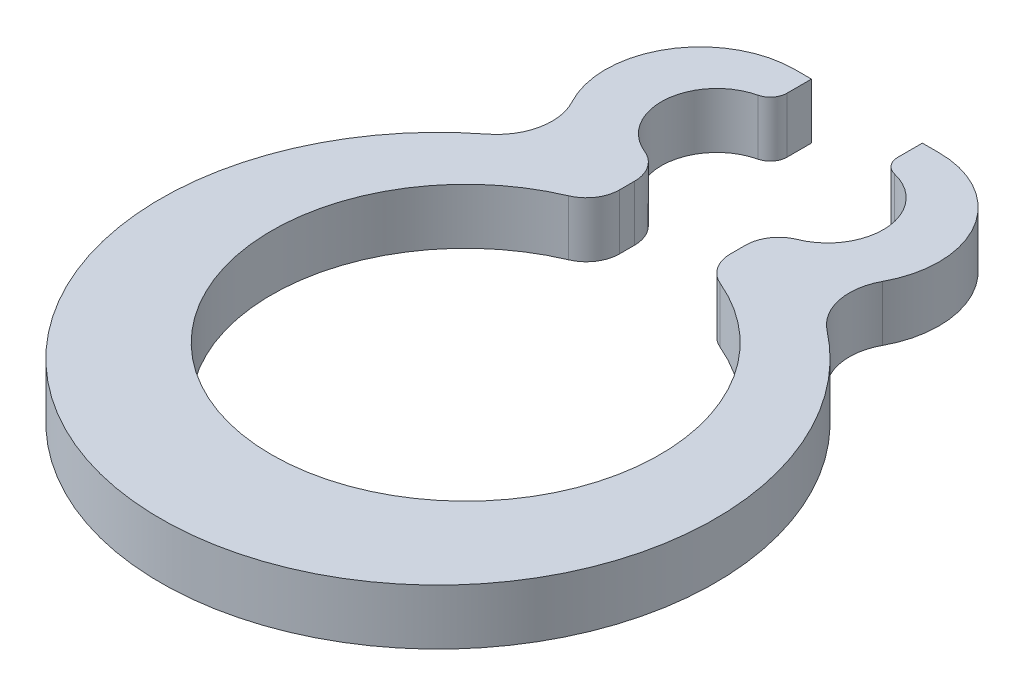
ISO-10303-21;
HEADER;
FILE_DESCRIPTION(('STEP AP214'),'2;1');
FILE_NAME('part.step','',(''),(''),'','','');
FILE_SCHEMA(('AUTOMOTIVE_DESIGN { 1 0 10303 214 1 1 1 1 }'));
ENDSEC;
DATA;
#1=APPLICATION_CONTEXT('core data for automotive mechanical design processes');
#2=APPLICATION_PROTOCOL_DEFINITION('international standard','automotive_design',2000,#1);
#3=PRODUCT_CONTEXT('',#1,'mechanical');
#4=PRODUCT('Part','Part','',(#3));
#5=PRODUCT_RELATED_PRODUCT_CATEGORY('part','',(#4));
#6=PRODUCT_DEFINITION_FORMATION('','',#4);
#7=PRODUCT_DEFINITION_CONTEXT('part definition',#1,'design');
#8=PRODUCT_DEFINITION('design','',#6,#7);
#9=PRODUCT_DEFINITION_SHAPE('','',#8);
#10=(LENGTH_UNIT() NAMED_UNIT(*) SI_UNIT(.MILLI.,.METRE.));
#11=(NAMED_UNIT(*) PLANE_ANGLE_UNIT() SI_UNIT($,.RADIAN.));
#12=(NAMED_UNIT(*) SI_UNIT($,.STERADIAN.) SOLID_ANGLE_UNIT());
#13=UNCERTAINTY_MEASURE_WITH_UNIT(LENGTH_MEASURE(1.E-05),#10,'distance_accuracy_value','');
#14=(GEOMETRIC_REPRESENTATION_CONTEXT(3) GLOBAL_UNCERTAINTY_ASSIGNED_CONTEXT((#13)) GLOBAL_UNIT_ASSIGNED_CONTEXT((#10,
#11,#12)) REPRESENTATION_CONTEXT('',''));
#15=CARTESIAN_POINT('',(0.,0.,0.));
#16=DIRECTION('',(0.,0.,1.));
#17=DIRECTION('',(1.,0.,0.));
#18=AXIS2_PLACEMENT_3D('',#15,#16,#17);
#19=CARTESIAN_POINT('',(-0.65,0.5,-3.6172697343063));
#20=DIRECTION('',(0.,0.,1.));
#21=DIRECTION('',(1.,0.,0.));
#22=AXIS2_PLACEMENT_3D('',#19,#20,#21);
#23=PLANE('',#22);
#24=DIRECTION('',(-1.,0.,0.));
#25=VECTOR('',#24,1.);
#26=CARTESIAN_POINT('',(-0.65,0.,-3.6172697343063));
#27=LINE('',#26,#25);
#28=CARTESIAN_POINT('',(-0.5,0.,-3.6172697343063));
#29=VERTEX_POINT('',#28);
#30=CARTESIAN_POINT('',(-0.65,0.,-3.6172697343063));
#31=VERTEX_POINT('',#30);
#32=EDGE_CURVE('E207',#29,#31,#27,.T.);
#33=ORIENTED_EDGE('',*,*,#32,.T.);
#34=DIRECTION('',(0.,-1.,0.));
#35=VECTOR('',#34,1.);
#36=CARTESIAN_POINT('',(-0.65,0.5,-3.6172697343063));
#37=LINE('',#36,#35);
#38=CARTESIAN_POINT('',(-0.65,0.5,-3.6172697343063));
#39=VERTEX_POINT('',#38);
#40=EDGE_CURVE('E11',#39,#31,#37,.T.);
#41=ORIENTED_EDGE('',*,*,#40,.F.);
#42=DIRECTION('',(-1.,0.,0.));
#43=VECTOR('',#42,1.);
#44=CARTESIAN_POINT('',(-0.65,0.5,-3.6172697343063));
#45=LINE('',#44,#43);
#46=CARTESIAN_POINT('',(-0.5,0.5,-3.6172697343063));
#47=VERTEX_POINT('',#46);
#48=EDGE_CURVE('E245',#47,#39,#45,.T.);
#49=ORIENTED_EDGE('',*,*,#48,.F.);
#50=DIRECTION('',(0.,-1.,0.));
#51=VECTOR('',#50,1.);
#52=CARTESIAN_POINT('',(-0.5,0.5,-3.6172697343063));
#53=LINE('',#52,#51);
#54=EDGE_CURVE('E203',#47,#29,#53,.T.);
#55=ORIENTED_EDGE('',*,*,#54,.T.);
#56=EDGE_LOOP('',(#33,#41,#49,#55));
#57=FACE_BOUND('',#56,.T.);
#58=ADVANCED_FACE('F39',(#57),#23,.F.);
#59=CARTESIAN_POINT('',(-0.65,0.5,-2.76407935800148));
#60=DIRECTION('',(0.,-1.,0.));
#61=DIRECTION('',(0.,0.,-1.));
#62=AXIS2_PLACEMENT_3D('',#59,#60,#61);
#63=CYLINDRICAL_SURFACE('',#62,0.853190376304816);
#64=CARTESIAN_POINT('',(-0.65,0.,-2.76407935800148));
#65=DIRECTION('',(0.,1.,0.));
#66=DIRECTION('',(0.,0.,1.));
#67=AXIS2_PLACEMENT_3D('',#64,#65,#66);
#68=CIRCLE('',#67,0.853190376304816);
#69=CARTESIAN_POINT('',(-1.40020629242879,0.,-2.35772441830048));
#70=VERTEX_POINT('',#69);
#71=EDGE_CURVE('E210',#31,#70,#68,.T.);
#72=ORIENTED_EDGE('',*,*,#71,.T.);
#73=DIRECTION('',(0.,-1.,0.));
#74=VECTOR('',#73,1.);
#75=CARTESIAN_POINT('',(-1.40020629242879,0.5,-2.35772441830048));
#76=LINE('',#75,#74);
#77=CARTESIAN_POINT('',(-1.40020629242879,0.5,-2.35772441830048));
#78=VERTEX_POINT('',#77);
#79=EDGE_CURVE('E47',#78,#70,#76,.T.);
#80=ORIENTED_EDGE('',*,*,#79,.F.);
#81=CARTESIAN_POINT('',(-0.65,0.5,-2.76407935800148));
#82=DIRECTION('',(0.,1.,0.));
#83=DIRECTION('',(0.,0.,1.));
#84=AXIS2_PLACEMENT_3D('',#81,#82,#83);
#85=CIRCLE('',#84,0.853190376304816);
#86=EDGE_CURVE('E134',#39,#78,#85,.T.);
#87=ORIENTED_EDGE('',*,*,#86,.F.);
#88=ORIENTED_EDGE('',*,*,#40,.T.);
#89=EDGE_LOOP('',(#72,#80,#87,#88));
#90=FACE_BOUND('',#89,.T.);
#91=ADVANCED_FACE('F363',(#90),#63,.T.);
#92=CARTESIAN_POINT('',(-1.83985394508865,0.5,-2.11958592600938));
#93=DIRECTION('',(0.,-1.,0.));
#94=DIRECTION('',(0.,0.,-1.));
#95=AXIS2_PLACEMENT_3D('',#92,#93,#94);
#96=CYLINDRICAL_SURFACE('',#95,0.5);
#97=CARTESIAN_POINT('',(-1.83985394508865,0.,-2.11958592600938));
#98=DIRECTION('',(0.,-1.,0.));
#99=DIRECTION('',(0.,0.,-1.));
#100=AXIS2_PLACEMENT_3D('',#97,#98,#99);
#101=CIRCLE('',#100,0.5);
#102=CARTESIAN_POINT('',(-1.5332116209072,0.,-1.72465493834115));
#103=VERTEX_POINT('',#102);
#104=EDGE_CURVE('E212',#70,#103,#101,.T.);
#105=ORIENTED_EDGE('',*,*,#104,.T.);
#106=DIRECTION('',(0.,-1.,0.));
#107=VECTOR('',#106,1.);
#108=CARTESIAN_POINT('',(-1.5332116209072,0.5,-1.72465493834115));
#109=LINE('',#108,#107);
#110=CARTESIAN_POINT('',(-1.5332116209072,0.5,-1.72465493834115));
#111=VERTEX_POINT('',#110);
#112=EDGE_CURVE('E288',#111,#103,#109,.T.);
#113=ORIENTED_EDGE('',*,*,#112,.F.);
#114=CARTESIAN_POINT('',(-1.83985394508865,0.5,-2.11958592600938));
#115=DIRECTION('',(0.,-1.,0.));
#116=DIRECTION('',(0.,0.,-1.));
#117=AXIS2_PLACEMENT_3D('',#114,#115,#116);
#118=CIRCLE('',#117,0.5);
#119=EDGE_CURVE('E296',#78,#111,#118,.T.);
#120=ORIENTED_EDGE('',*,*,#119,.F.);
#121=ORIENTED_EDGE('',*,*,#79,.T.);
#122=EDGE_LOOP('',(#105,#113,#120,#121));
#123=FACE_BOUND('',#122,.T.);
#124=ADVANCED_FACE('F294',(#123),#96,.F.);
#125=CARTESIAN_POINT('',(0.,0.5,0.25));
#126=DIRECTION('',(0.,-1.,0.));
#127=DIRECTION('',(0.,0.,-1.));
#128=AXIS2_PLACEMENT_3D('',#125,#126,#127);
#129=CYLINDRICAL_SURFACE('',#128,2.5);
#130=CARTESIAN_POINT('',(0.,0.,0.25));
#131=DIRECTION('',(0.,1.,0.));
#132=DIRECTION('',(0.,0.,1.));
#133=AXIS2_PLACEMENT_3D('',#130,#131,#132);
#134=CIRCLE('',#133,2.5);
#135=CARTESIAN_POINT('',(1.5332116209072,0.,-1.72465493834115));
#136=VERTEX_POINT('',#135);
#137=EDGE_CURVE('E214',#103,#136,#134,.T.);
#138=ORIENTED_EDGE('',*,*,#137,.T.);
#139=DIRECTION('',(0.,-1.,0.));
#140=VECTOR('',#139,1.);
#141=CARTESIAN_POINT('',(1.5332116209072,0.5,-1.72465493834115));
#142=LINE('',#141,#140);
#143=CARTESIAN_POINT('',(1.5332116209072,0.5,-1.72465493834115));
#144=VERTEX_POINT('',#143);
#145=EDGE_CURVE('E285',#144,#136,#142,.T.);
#146=ORIENTED_EDGE('',*,*,#145,.F.);
#147=CARTESIAN_POINT('',(0.,0.5,0.25));
#148=DIRECTION('',(0.,1.,0.));
#149=DIRECTION('',(0.,0.,1.));
#150=AXIS2_PLACEMENT_3D('',#147,#148,#149);
#151=CIRCLE('',#150,2.5);
#152=EDGE_CURVE('E314',#111,#144,#151,.T.);
#153=ORIENTED_EDGE('',*,*,#152,.F.);
#154=ORIENTED_EDGE('',*,*,#112,.T.);
#155=EDGE_LOOP('',(#138,#146,#153,#154));
#156=FACE_BOUND('',#155,.T.);
#157=ADVANCED_FACE('F305',(#156),#129,.T.);
#158=CARTESIAN_POINT('',(1.83985394508865,0.5,-2.11958592600938));
#159=DIRECTION('',(0.,-1.,0.));
#160=DIRECTION('',(0.,0.,-1.));
#161=AXIS2_PLACEMENT_3D('',#158,#159,#160);
#162=CYLINDRICAL_SURFACE('',#161,0.5);
#163=CARTESIAN_POINT('',(1.83985394508865,0.,-2.11958592600938));
#164=DIRECTION('',(0.,-1.,0.));
#165=DIRECTION('',(0.,0.,1.));
#166=AXIS2_PLACEMENT_3D('',#163,#164,#165);
#167=CIRCLE('',#166,0.5);
#168=CARTESIAN_POINT('',(1.40020629242879,0.,-2.35772441830048));
#169=VERTEX_POINT('',#168);
#170=EDGE_CURVE('E216',#136,#169,#167,.T.);
#171=ORIENTED_EDGE('',*,*,#170,.T.);
#172=DIRECTION('',(0.,-1.,0.));
#173=VECTOR('',#172,1.);
#174=CARTESIAN_POINT('',(1.40020629242879,0.5,-2.35772441830048));
#175=LINE('',#174,#173);
#176=CARTESIAN_POINT('',(1.40020629242879,0.5,-2.35772441830048));
#177=VERTEX_POINT('',#176);
#178=EDGE_CURVE('E282',#177,#169,#175,.T.);
#179=ORIENTED_EDGE('',*,*,#178,.F.);
#180=CARTESIAN_POINT('',(1.83985394508865,0.5,-2.11958592600938));
#181=DIRECTION('',(0.,-1.,0.));
#182=DIRECTION('',(0.,0.,1.));
#183=AXIS2_PLACEMENT_3D('',#180,#181,#182);
#184=CIRCLE('',#183,0.5);
#185=EDGE_CURVE('E311',#144,#177,#184,.T.);
#186=ORIENTED_EDGE('',*,*,#185,.F.);
#187=ORIENTED_EDGE('',*,*,#145,.T.);
#188=EDGE_LOOP('',(#171,#179,#186,#187));
#189=FACE_BOUND('',#188,.T.);
#190=ADVANCED_FACE('F309',(#189),#162,.F.);
#191=CARTESIAN_POINT('',(0.65,0.5,-2.76407935800148));
#192=DIRECTION('',(0.,-1.,0.));
#193=DIRECTION('',(0.,0.,-1.));
#194=AXIS2_PLACEMENT_3D('',#191,#192,#193);
#195=CYLINDRICAL_SURFACE('',#194,0.853190376304816);
#196=CARTESIAN_POINT('',(0.65,0.,-2.76407935800148));
#197=DIRECTION('',(0.,1.,0.));
#198=DIRECTION('',(0.,0.,1.));
#199=AXIS2_PLACEMENT_3D('',#196,#197,#198);
#200=CIRCLE('',#199,0.853190376304816);
#201=CARTESIAN_POINT('',(0.65,0.,-3.6172697343063));
#202=VERTEX_POINT('',#201);
#203=EDGE_CURVE('E218',#169,#202,#200,.T.);
#204=ORIENTED_EDGE('',*,*,#203,.T.);
#205=DIRECTION('',(0.,-1.,0.));
#206=VECTOR('',#205,1.);
#207=CARTESIAN_POINT('',(0.65,0.5,-3.6172697343063));
#208=LINE('',#207,#206);
#209=CARTESIAN_POINT('',(0.65,0.5,-3.6172697343063));
#210=VERTEX_POINT('',#209);
#211=EDGE_CURVE('E279',#210,#202,#208,.T.);
#212=ORIENTED_EDGE('',*,*,#211,.F.);
#213=CARTESIAN_POINT('',(0.65,0.5,-2.76407935800148));
#214=DIRECTION('',(0.,1.,0.));
#215=DIRECTION('',(0.,0.,1.));
#216=AXIS2_PLACEMENT_3D('',#213,#214,#215);
#217=CIRCLE('',#216,0.853190376304816);
#218=EDGE_CURVE('E313',#177,#210,#217,.T.);
#219=ORIENTED_EDGE('',*,*,#218,.F.);
#220=ORIENTED_EDGE('',*,*,#178,.T.);
#221=EDGE_LOOP('',(#204,#212,#219,#220));
#222=FACE_BOUND('',#221,.T.);
#223=ADVANCED_FACE('F376',(#222),#195,.T.);
#224=CARTESIAN_POINT('',(0.5,0.5,-3.6172697343063));
#225=DIRECTION('',(0.,0.,1.));
#226=DIRECTION('',(1.,0.,0.));
#227=AXIS2_PLACEMENT_3D('',#224,#225,#226);
#228=PLANE('',#227);
#229=DIRECTION('',(-1.,0.,0.));
#230=VECTOR('',#229,1.);
#231=CARTESIAN_POINT('',(0.5,0.,-3.6172697343063));
#232=LINE('',#231,#230);
#233=CARTESIAN_POINT('',(0.5,0.,-3.6172697343063));
#234=VERTEX_POINT('',#233);
#235=EDGE_CURVE('E220',#202,#234,#232,.T.);
#236=ORIENTED_EDGE('',*,*,#235,.T.);
#237=DIRECTION('',(0.,-1.,0.));
#238=VECTOR('',#237,1.);
#239=CARTESIAN_POINT('',(0.5,0.5,-3.6172697343063));
#240=LINE('',#239,#238);
#241=CARTESIAN_POINT('',(0.5,0.5,-3.6172697343063));
#242=VERTEX_POINT('',#241);
#243=EDGE_CURVE('E276',#242,#234,#240,.T.);
#244=ORIENTED_EDGE('',*,*,#243,.F.);
#245=DIRECTION('',(-1.,0.,0.));
#246=VECTOR('',#245,1.);
#247=CARTESIAN_POINT('',(0.5,0.5,-3.6172697343063));
#248=LINE('',#247,#246);
#249=EDGE_CURVE('E316',#210,#242,#248,.T.);
#250=ORIENTED_EDGE('',*,*,#249,.F.);
#251=ORIENTED_EDGE('',*,*,#211,.T.);
#252=EDGE_LOOP('',(#236,#244,#250,#251));
#253=FACE_BOUND('',#252,.T.);
#254=ADVANCED_FACE('F379',(#253),#228,.F.);
#255=CARTESIAN_POINT('',(0.5,0.5,-3.39653489003516));
#256=DIRECTION('',(1.,0.,0.));
#257=DIRECTION('',(0.,0.,-1.));
#258=AXIS2_PLACEMENT_3D('',#255,#256,#257);
#259=PLANE('',#258);
#260=DIRECTION('',(0.,0.,1.));
#261=VECTOR('',#260,1.);
#262=CARTESIAN_POINT('',(0.5,0.,-3.39653489003516));
#263=LINE('',#262,#261);
#264=CARTESIAN_POINT('',(0.5,0.,-3.39653489003516));
#265=VERTEX_POINT('',#264);
#266=EDGE_CURVE('E222',#234,#265,#263,.T.);
#267=ORIENTED_EDGE('',*,*,#266,.T.);
#268=DIRECTION('',(0.,-1.,0.));
#269=VECTOR('',#268,1.);
#270=CARTESIAN_POINT('',(0.5,0.5,-3.39653489003516));
#271=LINE('',#270,#269);
#272=CARTESIAN_POINT('',(0.5,0.5,-3.39653489003516));
#273=VERTEX_POINT('',#272);
#274=EDGE_CURVE('E273',#273,#265,#271,.T.);
#275=ORIENTED_EDGE('',*,*,#274,.F.);
#276=DIRECTION('',(0.,0.,1.));
#277=VECTOR('',#276,1.);
#278=CARTESIAN_POINT('',(0.5,0.5,-3.39653489003516));
#279=LINE('',#278,#277);
#280=EDGE_CURVE('E322',#242,#273,#279,.T.);
#281=ORIENTED_EDGE('',*,*,#280,.F.);
#282=ORIENTED_EDGE('',*,*,#243,.T.);
#283=EDGE_LOOP('',(#267,#275,#281,#282));
#284=FACE_BOUND('',#283,.T.);
#285=ADVANCED_FACE('F383',(#284),#259,.F.);
#286=CARTESIAN_POINT('',(0.65,0.5,-3.39653489003516));
#287=DIRECTION('',(0.,-1.,0.));
#288=DIRECTION('',(0.,0.,-1.));
#289=AXIS2_PLACEMENT_3D('',#286,#287,#288);
#290=CYLINDRICAL_SURFACE('',#289,0.15);
#291=CARTESIAN_POINT('',(0.65,0.,-3.39653489003516));
#292=DIRECTION('',(0.,1.,0.));
#293=DIRECTION('',(0.,0.,1.));
#294=AXIS2_PLACEMENT_3D('',#291,#292,#293);
#295=CIRCLE('',#294,0.15);
#296=CARTESIAN_POINT('',(0.615384615384615,0.,-3.250583613412));
#297=VERTEX_POINT('',#296);
#298=EDGE_CURVE('E224',#265,#297,#295,.T.);
#299=ORIENTED_EDGE('',*,*,#298,.T.);
#300=DIRECTION('',(0.,-1.,0.));
#301=VECTOR('',#300,1.);
#302=CARTESIAN_POINT('',(0.615384615384615,0.5,-3.250583613412));
#303=LINE('',#302,#301);
#304=CARTESIAN_POINT('',(0.615384615384615,0.5,-3.250583613412));
#305=VERTEX_POINT('',#304);
#306=EDGE_CURVE('E270',#305,#297,#303,.T.);
#307=ORIENTED_EDGE('',*,*,#306,.F.);
#308=CARTESIAN_POINT('',(0.65,0.5,-3.39653489003516));
#309=DIRECTION('',(0.,1.,0.));
#310=DIRECTION('',(0.,0.,1.));
#311=AXIS2_PLACEMENT_3D('',#308,#309,#310);
#312=CIRCLE('',#311,0.15);
#313=EDGE_CURVE('E324',#273,#305,#312,.T.);
#314=ORIENTED_EDGE('',*,*,#313,.F.);
#315=ORIENTED_EDGE('',*,*,#274,.T.);
#316=EDGE_LOOP('',(#299,#307,#314,#315));
#317=FACE_BOUND('',#316,.T.);
#318=ADVANCED_FACE('F387',(#317),#290,.T.);
#319=CARTESIAN_POINT('',(0.5,0.5,-2.76407935800148));
#320=DIRECTION('',(0.,-1.,0.));
#321=DIRECTION('',(0.,0.,-1.));
#322=AXIS2_PLACEMENT_3D('',#319,#320,#321);
#323=CYLINDRICAL_SURFACE('',#322,0.5);
#324=CARTESIAN_POINT('',(0.5,0.,-2.76407935800148));
#325=DIRECTION('',(0.,-1.,0.));
#326=DIRECTION('',(0.,0.,1.));
#327=AXIS2_PLACEMENT_3D('',#324,#325,#326);
#328=CIRCLE('',#327,0.5);
#329=CARTESIAN_POINT('',(0.6875,0.,-2.300566952558));
#330=VERTEX_POINT('',#329);
#331=EDGE_CURVE('E226',#297,#330,#328,.T.);
#332=ORIENTED_EDGE('',*,*,#331,.T.);
#333=DIRECTION('',(0.,-1.,0.));
#334=VECTOR('',#333,1.);
#335=CARTESIAN_POINT('',(0.6875,0.5,-2.300566952558));
#336=LINE('',#335,#334);
#337=CARTESIAN_POINT('',(0.6875,0.5,-2.300566952558));
#338=VERTEX_POINT('',#337);
#339=EDGE_CURVE('E267',#338,#330,#336,.T.);
#340=ORIENTED_EDGE('',*,*,#339,.F.);
#341=CARTESIAN_POINT('',(0.5,0.5,-2.76407935800148));
#342=DIRECTION('',(0.,-1.,0.));
#343=DIRECTION('',(0.,0.,1.));
#344=AXIS2_PLACEMENT_3D('',#341,#342,#343);
#345=CIRCLE('',#344,0.5);
#346=EDGE_CURVE('E326',#305,#338,#345,.T.);
#347=ORIENTED_EDGE('',*,*,#346,.F.);
#348=ORIENTED_EDGE('',*,*,#306,.T.);
#349=EDGE_LOOP('',(#332,#340,#347,#348));
#350=FACE_BOUND('',#349,.T.);
#351=ADVANCED_FACE('F391',(#350),#323,.F.);
#352=CARTESIAN_POINT('',(0.8,0.5,-2.02245950929191));
#353=DIRECTION('',(0.,-1.,0.));
#354=DIRECTION('',(0.,0.,-1.));
#355=AXIS2_PLACEMENT_3D('',#352,#353,#354);
#356=CYLINDRICAL_SURFACE('',#355,0.3);
#357=CARTESIAN_POINT('',(0.8,0.,-2.02245950929191));
#358=DIRECTION('',(0.,1.,0.));
#359=DIRECTION('',(0.,0.,-1.));
#360=AXIS2_PLACEMENT_3D('',#357,#358,#359);
#361=CIRCLE('',#360,0.3);
#362=CARTESIAN_POINT('',(0.5,0.,-2.02245950929191));
#363=VERTEX_POINT('',#362);
#364=EDGE_CURVE('E228',#330,#363,#361,.T.);
#365=ORIENTED_EDGE('',*,*,#364,.T.);
#366=DIRECTION('',(0.,-1.,0.));
#367=VECTOR('',#366,1.);
#368=CARTESIAN_POINT('',(0.5,0.5,-2.02245950929191));
#369=LINE('',#368,#367);
#370=CARTESIAN_POINT('',(0.5,0.5,-2.02245950929191));
#371=VERTEX_POINT('',#370);
#372=EDGE_CURVE('E264',#371,#363,#369,.T.);
#373=ORIENTED_EDGE('',*,*,#372,.F.);
#374=CARTESIAN_POINT('',(0.8,0.5,-2.02245950929191));
#375=DIRECTION('',(0.,1.,0.));
#376=DIRECTION('',(0.,0.,-1.));
#377=AXIS2_PLACEMENT_3D('',#374,#375,#376);
#378=CIRCLE('',#377,0.3);
#379=EDGE_CURVE('E328',#338,#371,#378,.T.);
#380=ORIENTED_EDGE('',*,*,#379,.F.);
#381=ORIENTED_EDGE('',*,*,#339,.T.);
#382=EDGE_LOOP('',(#365,#373,#380,#381));
#383=FACE_BOUND('',#382,.T.);
#384=ADVANCED_FACE('F395',(#383),#356,.T.);
#385=CARTESIAN_POINT('',(0.5,0.5,-1.88745860881769));
#386=DIRECTION('',(1.,0.,0.));
#387=DIRECTION('',(0.,0.,-1.));
#388=AXIS2_PLACEMENT_3D('',#385,#386,#387);
#389=PLANE('',#388);
#390=DIRECTION('',(0.,0.,1.));
#391=VECTOR('',#390,1.);
#392=CARTESIAN_POINT('',(0.5,0.,-1.88745860881769));
#393=LINE('',#392,#391);
#394=CARTESIAN_POINT('',(0.5,0.,-1.88745860881769));
#395=VERTEX_POINT('',#394);
#396=EDGE_CURVE('E230',#363,#395,#393,.T.);
#397=ORIENTED_EDGE('',*,*,#396,.T.);
#398=DIRECTION('',(0.,-1.,0.));
#399=VECTOR('',#398,1.);
#400=CARTESIAN_POINT('',(0.5,0.5,-1.88745860881769));
#401=LINE('',#400,#399);
#402=CARTESIAN_POINT('',(0.5,0.5,-1.88745860881769));
#403=VERTEX_POINT('',#402);
#404=EDGE_CURVE('E261',#403,#395,#401,.T.);
#405=ORIENTED_EDGE('',*,*,#404,.F.);
#406=DIRECTION('',(0.,0.,1.));
#407=VECTOR('',#406,1.);
#408=CARTESIAN_POINT('',(0.5,0.5,-1.88745860881769));
#409=LINE('',#408,#407);
#410=EDGE_CURVE('E330',#371,#403,#409,.T.);
#411=ORIENTED_EDGE('',*,*,#410,.F.);
#412=ORIENTED_EDGE('',*,*,#372,.T.);
#413=EDGE_LOOP('',(#397,#405,#411,#412));
#414=FACE_BOUND('',#413,.T.);
#415=ADVANCED_FACE('F399',(#414),#389,.F.);
#416=CARTESIAN_POINT('',(0.8,0.5,-1.88745860881769));
#417=DIRECTION('',(0.,-1.,0.));
#418=DIRECTION('',(0.,0.,-1.));
#419=AXIS2_PLACEMENT_3D('',#416,#417,#418);
#420=CYLINDRICAL_SURFACE('',#419,0.3);
#421=CARTESIAN_POINT('',(0.8,0.,-1.88745860881769));
#422=DIRECTION('',(0.,1.,0.));
#423=DIRECTION('',(0.,0.,1.));
#424=AXIS2_PLACEMENT_3D('',#421,#422,#423);
#425=CIRCLE('',#424,0.3);
#426=CARTESIAN_POINT('',(0.682926829268293,0.,-1.61124515386876));
#427=VERTEX_POINT('',#426);
#428=EDGE_CURVE('E232',#395,#427,#425,.T.);
#429=ORIENTED_EDGE('',*,*,#428,.T.);
#430=DIRECTION('',(0.,-1.,0.));
#431=VECTOR('',#430,1.);
#432=CARTESIAN_POINT('',(0.682926829268293,0.5,-1.61124515386876));
#433=LINE('',#432,#431);
#434=CARTESIAN_POINT('',(0.682926829268293,0.5,-1.61124515386876));
#435=VERTEX_POINT('',#434);
#436=EDGE_CURVE('E258',#435,#427,#433,.T.);
#437=ORIENTED_EDGE('',*,*,#436,.F.);
#438=CARTESIAN_POINT('',(0.8,0.5,-1.88745860881769));
#439=DIRECTION('',(0.,1.,0.));
#440=DIRECTION('',(0.,0.,1.));
#441=AXIS2_PLACEMENT_3D('',#438,#439,#440);
#442=CIRCLE('',#441,0.3);
#443=EDGE_CURVE('E332',#403,#435,#442,.T.);
#444=ORIENTED_EDGE('',*,*,#443,.F.);
#445=ORIENTED_EDGE('',*,*,#404,.T.);
#446=EDGE_LOOP('',(#429,#437,#444,#445));
#447=FACE_BOUND('',#446,.T.);
#448=ADVANCED_FACE('F403',(#447),#420,.T.);
#449=CARTESIAN_POINT('',(0.,0.5,0.));
#450=DIRECTION('',(0.,-1.,0.));
#451=DIRECTION('',(0.,0.,-1.));
#452=AXIS2_PLACEMENT_3D('',#449,#450,#451);
#453=CYLINDRICAL_SURFACE('',#452,1.75);
#454=CARTESIAN_POINT('',(0.,0.,0.));
#455=DIRECTION('',(0.,-1.,0.));
#456=DIRECTION('',(0.,0.,1.));
#457=AXIS2_PLACEMENT_3D('',#454,#455,#456);
#458=CIRCLE('',#457,1.75);
#459=CARTESIAN_POINT('',(-0.682926829268293,0.,-1.61124515386876));
#460=VERTEX_POINT('',#459);
#461=EDGE_CURVE('E234',#427,#460,#458,.T.);
#462=ORIENTED_EDGE('',*,*,#461,.T.);
#463=DIRECTION('',(0.,-1.,0.));
#464=VECTOR('',#463,1.);
#465=CARTESIAN_POINT('',(-0.682926829268293,0.5,-1.61124515386876));
#466=LINE('',#465,#464);
#467=CARTESIAN_POINT('',(-0.682926829268293,0.5,-1.61124515386876));
#468=VERTEX_POINT('',#467);
#469=EDGE_CURVE('E255',#468,#460,#466,.T.);
#470=ORIENTED_EDGE('',*,*,#469,.F.);
#471=CARTESIAN_POINT('',(0.,0.5,0.));
#472=DIRECTION('',(0.,-1.,0.));
#473=DIRECTION('',(0.,0.,1.));
#474=AXIS2_PLACEMENT_3D('',#471,#472,#473);
#475=CIRCLE('',#474,1.75);
#476=EDGE_CURVE('E334',#435,#468,#475,.T.);
#477=ORIENTED_EDGE('',*,*,#476,.F.);
#478=ORIENTED_EDGE('',*,*,#436,.T.);
#479=EDGE_LOOP('',(#462,#470,#477,#478));
#480=FACE_BOUND('',#479,.T.);
#481=ADVANCED_FACE('F407',(#480),#453,.F.);
#482=CARTESIAN_POINT('',(-0.8,0.5,-1.88745860881769));
#483=DIRECTION('',(0.,-1.,0.));
#484=DIRECTION('',(0.,0.,-1.));
#485=AXIS2_PLACEMENT_3D('',#482,#483,#484);
#486=CYLINDRICAL_SURFACE('',#485,0.3);
#487=CARTESIAN_POINT('',(-0.8,0.,-1.88745860881769));
#488=DIRECTION('',(0.,1.,0.));
#489=DIRECTION('',(0.,0.,-1.));
#490=AXIS2_PLACEMENT_3D('',#487,#488,#489);
#491=CIRCLE('',#490,0.3);
#492=CARTESIAN_POINT('',(-0.5,0.,-1.88745860881769));
#493=VERTEX_POINT('',#492);
#494=EDGE_CURVE('E236',#460,#493,#491,.T.);
#495=ORIENTED_EDGE('',*,*,#494,.T.);
#496=DIRECTION('',(0.,-1.,0.));
#497=VECTOR('',#496,1.);
#498=CARTESIAN_POINT('',(-0.5,0.5,-1.88745860881769));
#499=LINE('',#498,#497);
#500=CARTESIAN_POINT('',(-0.5,0.5,-1.88745860881769));
#501=VERTEX_POINT('',#500);
#502=EDGE_CURVE('E252',#501,#493,#499,.T.);
#503=ORIENTED_EDGE('',*,*,#502,.F.);
#504=CARTESIAN_POINT('',(-0.8,0.5,-1.88745860881769));
#505=DIRECTION('',(0.,1.,0.));
#506=DIRECTION('',(0.,0.,-1.));
#507=AXIS2_PLACEMENT_3D('',#504,#505,#506);
#508=CIRCLE('',#507,0.3);
#509=EDGE_CURVE('E336',#468,#501,#508,.T.);
#510=ORIENTED_EDGE('',*,*,#509,.F.);
#511=ORIENTED_EDGE('',*,*,#469,.T.);
#512=EDGE_LOOP('',(#495,#503,#510,#511));
#513=FACE_BOUND('',#512,.T.);
#514=ADVANCED_FACE('F411',(#513),#486,.T.);
#515=CARTESIAN_POINT('',(-0.5,0.5,-1.88745860881769));
#516=DIRECTION('',(-1.,0.,0.));
#517=DIRECTION('',(0.,0.,1.));
#518=AXIS2_PLACEMENT_3D('',#515,#516,#517);
#519=PLANE('',#518);
#520=DIRECTION('',(0.,0.,-1.));
#521=VECTOR('',#520,1.);
#522=CARTESIAN_POINT('',(-0.5,0.,-1.88745860881769));
#523=LINE('',#522,#521);
#524=CARTESIAN_POINT('',(-0.5,0.,-2.02245950929191));
#525=VERTEX_POINT('',#524);
#526=EDGE_CURVE('E238',#493,#525,#523,.T.);
#527=ORIENTED_EDGE('',*,*,#526,.T.);
#528=DIRECTION('',(0.,-1.,0.));
#529=VECTOR('',#528,1.);
#530=CARTESIAN_POINT('',(-0.5,0.5,-2.02245950929191));
#531=LINE('',#530,#529);
#532=CARTESIAN_POINT('',(-0.5,0.5,-2.02245950929191));
#533=VERTEX_POINT('',#532);
#534=EDGE_CURVE('E249',#533,#525,#531,.T.);
#535=ORIENTED_EDGE('',*,*,#534,.F.);
#536=DIRECTION('',(0.,0.,-1.));
#537=VECTOR('',#536,1.);
#538=CARTESIAN_POINT('',(-0.5,0.5,-1.88745860881769));
#539=LINE('',#538,#537);
#540=EDGE_CURVE('E338',#501,#533,#539,.T.);
#541=ORIENTED_EDGE('',*,*,#540,.F.);
#542=ORIENTED_EDGE('',*,*,#502,.T.);
#543=EDGE_LOOP('',(#527,#535,#541,#542));
#544=FACE_BOUND('',#543,.T.);
#545=ADVANCED_FACE('F344',(#544),#519,.F.);
#546=CARTESIAN_POINT('',(-0.8,0.5,-2.02245950929191));
#547=DIRECTION('',(0.,-1.,0.));
#548=DIRECTION('',(0.,0.,-1.));
#549=AXIS2_PLACEMENT_3D('',#546,#547,#548);
#550=CYLINDRICAL_SURFACE('',#549,0.3);
#551=CARTESIAN_POINT('',(-0.8,0.,-2.02245950929191));
#552=DIRECTION('',(0.,1.,0.));
#553=DIRECTION('',(0.,0.,1.));
#554=AXIS2_PLACEMENT_3D('',#551,#552,#553);
#555=CIRCLE('',#554,0.3);
#556=CARTESIAN_POINT('',(-0.6875,0.,-2.300566952558));
#557=VERTEX_POINT('',#556);
#558=EDGE_CURVE('E240',#525,#557,#555,.T.);
#559=ORIENTED_EDGE('',*,*,#558,.T.);
#560=DIRECTION('',(0.,-1.,0.));
#561=VECTOR('',#560,1.);
#562=CARTESIAN_POINT('',(-0.6875,0.5,-2.300566952558));
#563=LINE('',#562,#561);
#564=CARTESIAN_POINT('',(-0.6875,0.5,-2.300566952558));
#565=VERTEX_POINT('',#564);
#566=EDGE_CURVE('E198',#565,#557,#563,.T.);
#567=ORIENTED_EDGE('',*,*,#566,.F.);
#568=CARTESIAN_POINT('',(-0.8,0.5,-2.02245950929191));
#569=DIRECTION('',(0.,1.,0.));
#570=DIRECTION('',(0.,0.,1.));
#571=AXIS2_PLACEMENT_3D('',#568,#569,#570);
#572=CIRCLE('',#571,0.3);
#573=EDGE_CURVE('E189',#533,#565,#572,.T.);
#574=ORIENTED_EDGE('',*,*,#573,.F.);
#575=ORIENTED_EDGE('',*,*,#534,.T.);
#576=EDGE_LOOP('',(#559,#567,#574,#575));
#577=FACE_BOUND('',#576,.T.);
#578=ADVANCED_FACE('F348',(#577),#550,.T.);
#579=CARTESIAN_POINT('',(-0.5,0.5,-2.76407935800148));
#580=DIRECTION('',(0.,-1.,0.));
#581=DIRECTION('',(0.,0.,-1.));
#582=AXIS2_PLACEMENT_3D('',#579,#580,#581);
#583=CYLINDRICAL_SURFACE('',#582,0.5);
#584=CARTESIAN_POINT('',(-0.5,0.,-2.76407935800148));
#585=DIRECTION('',(0.,-1.,0.));
#586=DIRECTION('',(0.,0.,1.));
#587=AXIS2_PLACEMENT_3D('',#584,#585,#586);
#588=CIRCLE('',#587,0.5);
#589=CARTESIAN_POINT('',(-0.615384615384615,0.,-3.250583613412));
#590=VERTEX_POINT('',#589);
#591=EDGE_CURVE('E197',#557,#590,#588,.T.);
#592=ORIENTED_EDGE('',*,*,#591,.T.);
#593=DIRECTION('',(0.,-1.,0.));
#594=VECTOR('',#593,1.);
#595=CARTESIAN_POINT('',(-0.615384615384615,0.5,-3.250583613412));
#596=LINE('',#595,#594);
#597=CARTESIAN_POINT('',(-0.615384615384615,0.5,-3.250583613412));
#598=VERTEX_POINT('',#597);
#599=EDGE_CURVE('E194',#598,#590,#596,.T.);
#600=ORIENTED_EDGE('',*,*,#599,.F.);
#601=CARTESIAN_POINT('',(-0.5,0.5,-2.76407935800148));
#602=DIRECTION('',(0.,-1.,0.));
#603=DIRECTION('',(0.,0.,1.));
#604=AXIS2_PLACEMENT_3D('',#601,#602,#603);
#605=CIRCLE('',#604,0.5);
#606=EDGE_CURVE('E183',#565,#598,#605,.T.);
#607=ORIENTED_EDGE('',*,*,#606,.F.);
#608=ORIENTED_EDGE('',*,*,#566,.T.);
#609=EDGE_LOOP('',(#592,#600,#607,#608));
#610=FACE_BOUND('',#609,.T.);
#611=ADVANCED_FACE('F195',(#610),#583,.F.);
#612=CARTESIAN_POINT('',(-0.65,0.5,-3.39653489003516));
#613=DIRECTION('',(0.,-1.,0.));
#614=DIRECTION('',(0.,0.,-1.));
#615=AXIS2_PLACEMENT_3D('',#612,#613,#614);
#616=CYLINDRICAL_SURFACE('',#615,0.15);
#617=CARTESIAN_POINT('',(-0.65,0.,-3.39653489003516));
#618=DIRECTION('',(0.,1.,0.));
#619=DIRECTION('',(0.,0.,-1.));
#620=AXIS2_PLACEMENT_3D('',#617,#618,#619);
#621=CIRCLE('',#620,0.15);
#622=CARTESIAN_POINT('',(-0.5,0.,-3.39653489003516));
#623=VERTEX_POINT('',#622);
#624=EDGE_CURVE('E120',#590,#623,#621,.T.);
#625=ORIENTED_EDGE('',*,*,#624,.T.);
#626=DIRECTION('',(0.,-1.,0.));
#627=VECTOR('',#626,1.);
#628=CARTESIAN_POINT('',(-0.5,0.5,-3.39653489003516));
#629=LINE('',#628,#627);
#630=CARTESIAN_POINT('',(-0.5,0.5,-3.39653489003516));
#631=VERTEX_POINT('',#630);
#632=EDGE_CURVE('E199',#631,#623,#629,.T.);
#633=ORIENTED_EDGE('',*,*,#632,.F.);
#634=CARTESIAN_POINT('',(-0.65,0.5,-3.39653489003516));
#635=DIRECTION('',(0.,1.,0.));
#636=DIRECTION('',(0.,0.,-1.));
#637=AXIS2_PLACEMENT_3D('',#634,#635,#636);
#638=CIRCLE('',#637,0.15);
#639=EDGE_CURVE('E187',#598,#631,#638,.T.);
#640=ORIENTED_EDGE('',*,*,#639,.F.);
#641=ORIENTED_EDGE('',*,*,#599,.T.);
#642=EDGE_LOOP('',(#625,#633,#640,#641));
#643=FACE_BOUND('',#642,.T.);
#644=ADVANCED_FACE('F201',(#643),#616,.T.);
#645=CARTESIAN_POINT('',(-0.5,0.5,-3.39653489003516));
#646=DIRECTION('',(-1.,0.,0.));
#647=DIRECTION('',(0.,0.,1.));
#648=AXIS2_PLACEMENT_3D('',#645,#646,#647);
#649=PLANE('',#648);
#650=DIRECTION('',(0.,0.,-1.));
#651=VECTOR('',#650,1.);
#652=CARTESIAN_POINT('',(-0.5,0.,-3.39653489003516));
#653=LINE('',#652,#651);
#654=EDGE_CURVE('E126',#623,#29,#653,.T.);
#655=ORIENTED_EDGE('',*,*,#654,.T.);
#656=ORIENTED_EDGE('',*,*,#54,.F.);
#657=DIRECTION('',(0.,0.,-1.));
#658=VECTOR('',#657,1.);
#659=CARTESIAN_POINT('',(-0.5,0.5,-3.39653489003516));
#660=LINE('',#659,#658);
#661=EDGE_CURVE('E55',#631,#47,#660,.T.);
#662=ORIENTED_EDGE('',*,*,#661,.F.);
#663=ORIENTED_EDGE('',*,*,#632,.T.);
#664=EDGE_LOOP('',(#655,#656,#662,#663));
#665=FACE_BOUND('',#664,.T.);
#666=ADVANCED_FACE('F352',(#665),#649,.F.);
#667=CARTESIAN_POINT('',(-0.65,0.5,-3.39653489003516));
#668=DIRECTION('',(0.,-1.,0.));
#669=DIRECTION('',(0.,0.,-1.));
#670=AXIS2_PLACEMENT_3D('',#667,#668,#669);
#671=PLANE('',#670);
#672=ORIENTED_EDGE('',*,*,#48,.T.);
#673=ORIENTED_EDGE('',*,*,#86,.T.);
#674=ORIENTED_EDGE('',*,*,#119,.T.);
#675=ORIENTED_EDGE('',*,*,#152,.T.);
#676=ORIENTED_EDGE('',*,*,#185,.T.);
#677=ORIENTED_EDGE('',*,*,#218,.T.);
#678=ORIENTED_EDGE('',*,*,#249,.T.);
#679=ORIENTED_EDGE('',*,*,#280,.T.);
#680=ORIENTED_EDGE('',*,*,#313,.T.);
#681=ORIENTED_EDGE('',*,*,#346,.T.);
#682=ORIENTED_EDGE('',*,*,#379,.T.);
#683=ORIENTED_EDGE('',*,*,#410,.T.);
#684=ORIENTED_EDGE('',*,*,#443,.T.);
#685=ORIENTED_EDGE('',*,*,#476,.T.);
#686=ORIENTED_EDGE('',*,*,#509,.T.);
#687=ORIENTED_EDGE('',*,*,#540,.T.);
#688=ORIENTED_EDGE('',*,*,#573,.T.);
#689=ORIENTED_EDGE('',*,*,#606,.T.);
#690=ORIENTED_EDGE('',*,*,#639,.T.);
#691=ORIENTED_EDGE('',*,*,#661,.T.);
#692=EDGE_LOOP('',(#672,#673,#674,#675,#676,#677,#678,#679,#680,#681,#682,#683,#684,#685,#686,
#687,#688,#689,#690,#691));
#693=FACE_BOUND('',#692,.T.);
#694=ADVANCED_FACE('F185',(#693),#671,.F.);
#695=CARTESIAN_POINT('',(-0.65,0.,-3.39653489003516));
#696=DIRECTION('',(0.,-1.,0.));
#697=DIRECTION('',(0.,0.,-1.));
#698=AXIS2_PLACEMENT_3D('',#695,#696,#697);
#699=PLANE('',#698);
#700=ORIENTED_EDGE('',*,*,#32,.F.);
#701=ORIENTED_EDGE('',*,*,#654,.F.);
#702=ORIENTED_EDGE('',*,*,#624,.F.);
#703=ORIENTED_EDGE('',*,*,#591,.F.);
#704=ORIENTED_EDGE('',*,*,#558,.F.);
#705=ORIENTED_EDGE('',*,*,#526,.F.);
#706=ORIENTED_EDGE('',*,*,#494,.F.);
#707=ORIENTED_EDGE('',*,*,#461,.F.);
#708=ORIENTED_EDGE('',*,*,#428,.F.);
#709=ORIENTED_EDGE('',*,*,#396,.F.);
#710=ORIENTED_EDGE('',*,*,#364,.F.);
#711=ORIENTED_EDGE('',*,*,#331,.F.);
#712=ORIENTED_EDGE('',*,*,#298,.F.);
#713=ORIENTED_EDGE('',*,*,#266,.F.);
#714=ORIENTED_EDGE('',*,*,#235,.F.);
#715=ORIENTED_EDGE('',*,*,#203,.F.);
#716=ORIENTED_EDGE('',*,*,#170,.F.);
#717=ORIENTED_EDGE('',*,*,#137,.F.);
#718=ORIENTED_EDGE('',*,*,#104,.F.);
#719=ORIENTED_EDGE('',*,*,#71,.F.);
#720=EDGE_LOOP('',(#700,#701,#702,#703,#704,#705,#706,#707,#708,#709,#710,#711,#712,#713,#714,
#715,#716,#717,#718,#719));
#721=FACE_BOUND('',#720,.T.);
#722=ADVANCED_FACE('F300',(#721),#699,.T.);
#723=CLOSED_SHELL('',(#58,#91,#124,#157,#190,#223,#254,#285,#318,#351,#384,#415,#448,#481,#514,
#545,#578,#611,#644,#666,#694,#722));
#724=MANIFOLD_SOLID_BREP('B2',#723);
#725=ADVANCED_BREP_SHAPE_REPRESENTATION('',(#18,#724),#14);
#726=SHAPE_DEFINITION_REPRESENTATION(#9,#725);
ENDSEC;
END-ISO-10303-21;
